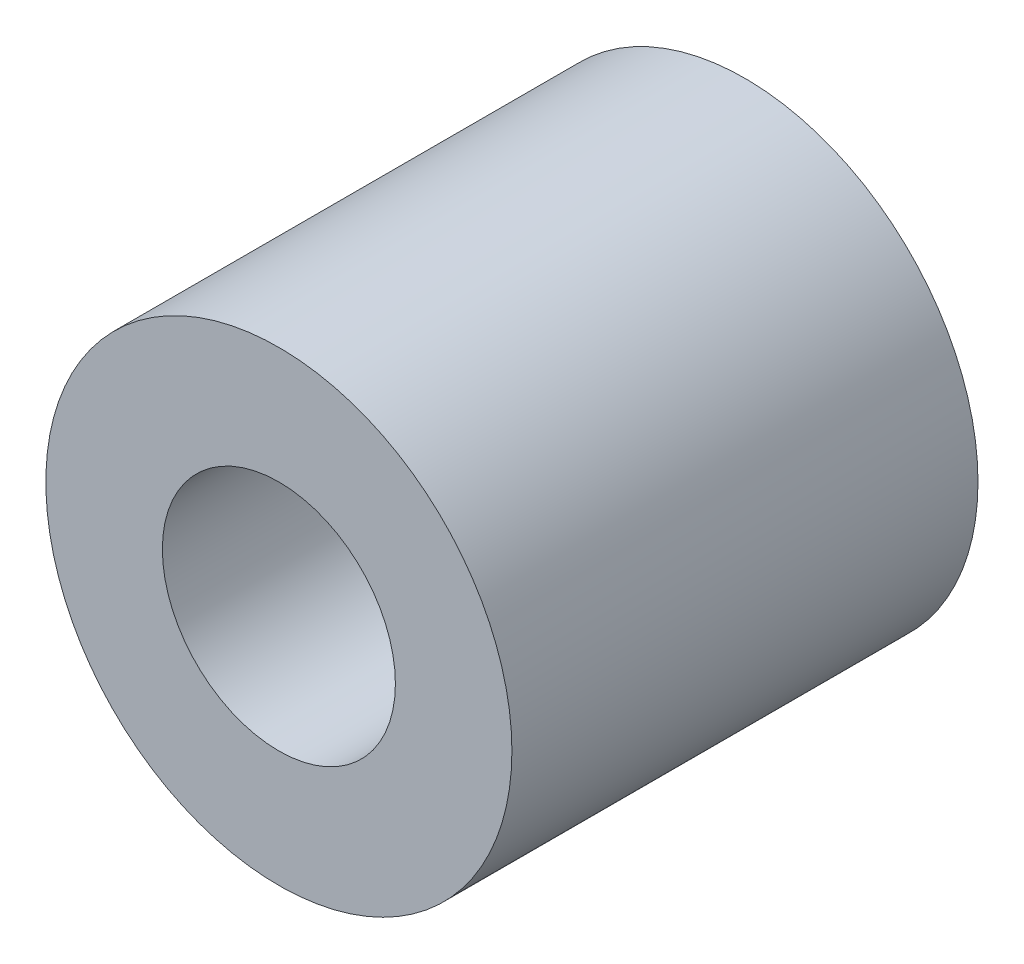
ISO-10303-21;
HEADER;
FILE_DESCRIPTION(('STEP AP214'),'2;1');
FILE_NAME('part.step','',(''),(''),'','','');
FILE_SCHEMA(('AUTOMOTIVE_DESIGN { 1 0 10303 214 1 1 1 1 }'));
ENDSEC;
DATA;
#1=APPLICATION_CONTEXT('core data for automotive mechanical design processes');
#2=APPLICATION_PROTOCOL_DEFINITION('international standard','automotive_design',2000,#1);
#3=PRODUCT_CONTEXT('',#1,'mechanical');
#4=PRODUCT('Part','Part','',(#3));
#5=PRODUCT_RELATED_PRODUCT_CATEGORY('part','',(#4));
#6=PRODUCT_DEFINITION_FORMATION('','',#4);
#7=PRODUCT_DEFINITION_CONTEXT('part definition',#1,'design');
#8=PRODUCT_DEFINITION('design','',#6,#7);
#9=PRODUCT_DEFINITION_SHAPE('','',#8);
#10=(LENGTH_UNIT() NAMED_UNIT(*) SI_UNIT(.MILLI.,.METRE.));
#11=(NAMED_UNIT(*) PLANE_ANGLE_UNIT() SI_UNIT($,.RADIAN.));
#12=(NAMED_UNIT(*) SI_UNIT($,.STERADIAN.) SOLID_ANGLE_UNIT());
#13=UNCERTAINTY_MEASURE_WITH_UNIT(LENGTH_MEASURE(1.E-05),#10,'distance_accuracy_value','');
#14=(GEOMETRIC_REPRESENTATION_CONTEXT(3) GLOBAL_UNCERTAINTY_ASSIGNED_CONTEXT((#13)) GLOBAL_UNIT_ASSIGNED_CONTEXT((#10,
#11,#12)) REPRESENTATION_CONTEXT('',''));
#15=CARTESIAN_POINT('',(0.,0.,0.));
#16=DIRECTION('',(0.,0.,1.));
#17=DIRECTION('',(1.,0.,0.));
#18=AXIS2_PLACEMENT_3D('',#15,#16,#17);
#19=CARTESIAN_POINT('',(0.,0.,0.));
#20=DIRECTION('',(0.,0.,1.));
#21=DIRECTION('',(1.,0.,0.));
#22=AXIS2_PLACEMENT_3D('',#19,#20,#21);
#23=CYLINDRICAL_SURFACE('',#22,3.);
#24=CARTESIAN_POINT('',(0.,0.,6.));
#25=DIRECTION('',(0.,0.,1.));
#26=DIRECTION('',(1.,0.,0.));
#27=AXIS2_PLACEMENT_3D('',#24,#25,#26);
#28=CIRCLE('',#27,3.);
#29=CARTESIAN_POINT('',(3.,0.,6.));
#30=VERTEX_POINT('',#29);
#31=EDGE_CURVE('E51',#30,#30,#28,.T.);
#32=ORIENTED_EDGE('',*,*,#31,.F.);
#33=EDGE_LOOP('',(#32));
#34=FACE_BOUND('',#33,.T.);
#35=CARTESIAN_POINT('',(0.,0.,0.));
#36=DIRECTION('',(0.,0.,1.));
#37=DIRECTION('',(1.,0.,0.));
#38=AXIS2_PLACEMENT_3D('',#35,#36,#37);
#39=CIRCLE('',#38,3.);
#40=CARTESIAN_POINT('',(3.,0.,0.));
#41=VERTEX_POINT('',#40);
#42=EDGE_CURVE('E40',#41,#41,#39,.T.);
#43=ORIENTED_EDGE('',*,*,#42,.T.);
#44=EDGE_LOOP('',(#43));
#45=FACE_BOUND('',#44,.T.);
#46=ADVANCED_FACE('F37',(#34,#45),#23,.T.);
#47=CARTESIAN_POINT('',(0.,0.,0.));
#48=DIRECTION('',(0.,0.,1.));
#49=DIRECTION('',(1.,0.,0.));
#50=AXIS2_PLACEMENT_3D('',#47,#48,#49);
#51=PLANE('',#50);
#52=CARTESIAN_POINT('',(0.,0.,0.));
#53=DIRECTION('',(0.,0.,1.));
#54=DIRECTION('',(1.,0.,0.));
#55=AXIS2_PLACEMENT_3D('',#52,#53,#54);
#56=CIRCLE('',#55,1.5);
#57=CARTESIAN_POINT('',(1.5,0.,0.));
#58=VERTEX_POINT('',#57);
#59=EDGE_CURVE('E45',#58,#58,#56,.F.);
#60=ORIENTED_EDGE('',*,*,#59,.F.);
#61=EDGE_LOOP('',(#60));
#62=FACE_BOUND('',#61,.T.);
#63=ORIENTED_EDGE('',*,*,#42,.F.);
#64=EDGE_LOOP('',(#63));
#65=FACE_BOUND('',#64,.T.);
#66=ADVANCED_FACE('F62',(#62,#65),#51,.F.);
#67=CARTESIAN_POINT('',(0.,0.,6.));
#68=DIRECTION('',(0.,0.,1.));
#69=DIRECTION('',(1.,0.,0.));
#70=AXIS2_PLACEMENT_3D('',#67,#68,#69);
#71=PLANE('',#70);
#72=CARTESIAN_POINT('',(0.,0.,6.));
#73=DIRECTION('',(0.,0.,1.));
#74=DIRECTION('',(1.,0.,0.));
#75=AXIS2_PLACEMENT_3D('',#72,#73,#74);
#76=CIRCLE('',#75,1.5);
#77=CARTESIAN_POINT('',(1.5,0.,6.));
#78=VERTEX_POINT('',#77);
#79=EDGE_CURVE('E10',#78,#78,#76,.F.);
#80=ORIENTED_EDGE('',*,*,#79,.T.);
#81=EDGE_LOOP('',(#80));
#82=FACE_BOUND('',#81,.T.);
#83=ORIENTED_EDGE('',*,*,#31,.T.);
#84=EDGE_LOOP('',(#83));
#85=FACE_BOUND('',#84,.T.);
#86=ADVANCED_FACE('F64',(#82,#85),#71,.T.);
#87=CARTESIAN_POINT('',(0.,0.,0.));
#88=DIRECTION('',(0.,0.,1.));
#89=DIRECTION('',(1.,0.,0.));
#90=AXIS2_PLACEMENT_3D('',#87,#88,#89);
#91=CYLINDRICAL_SURFACE('',#90,1.5);
#92=ORIENTED_EDGE('',*,*,#79,.F.);
#93=EDGE_LOOP('',(#92));
#94=FACE_BOUND('',#93,.T.);
#95=ORIENTED_EDGE('',*,*,#59,.T.);
#96=EDGE_LOOP('',(#95));
#97=FACE_BOUND('',#96,.T.);
#98=ADVANCED_FACE('F70',(#94,#97),#91,.F.);
#99=CLOSED_SHELL('',(#46,#66,#86,#98));
#100=MANIFOLD_SOLID_BREP('B2',#99);
#101=ADVANCED_BREP_SHAPE_REPRESENTATION('',(#18,#100),#14);
#102=SHAPE_DEFINITION_REPRESENTATION(#9,#101);
ENDSEC;
END-ISO-10303-21;
